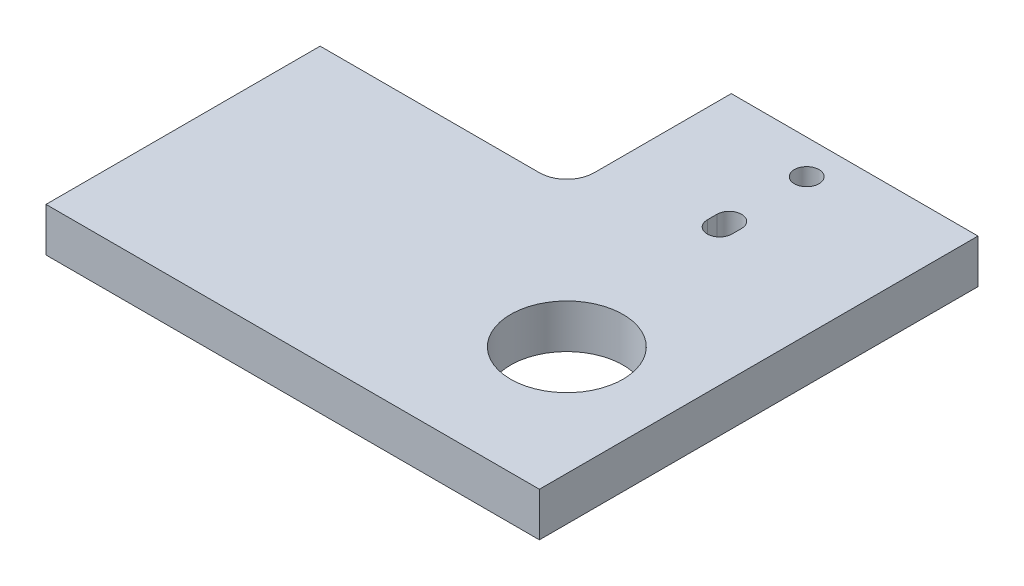
ISO-10303-21;
HEADER;
FILE_DESCRIPTION(('STEP AP214'),'2;1');
FILE_NAME('part.step','',(''),(''),'','','');
FILE_SCHEMA(('AUTOMOTIVE_DESIGN { 1 0 10303 214 1 1 1 1 }'));
ENDSEC;
DATA;
#1=APPLICATION_CONTEXT('core data for automotive mechanical design processes');
#2=APPLICATION_PROTOCOL_DEFINITION('international standard','automotive_design',2000,#1);
#3=PRODUCT_CONTEXT('',#1,'mechanical');
#4=PRODUCT('Part','Part','',(#3));
#5=PRODUCT_RELATED_PRODUCT_CATEGORY('part','',(#4));
#6=PRODUCT_DEFINITION_FORMATION('','',#4);
#7=PRODUCT_DEFINITION_CONTEXT('part definition',#1,'design');
#8=PRODUCT_DEFINITION('design','',#6,#7);
#9=PRODUCT_DEFINITION_SHAPE('','',#8);
#10=(LENGTH_UNIT() NAMED_UNIT(*) SI_UNIT(.MILLI.,.METRE.));
#11=(NAMED_UNIT(*) PLANE_ANGLE_UNIT() SI_UNIT($,.RADIAN.));
#12=(NAMED_UNIT(*) SI_UNIT($,.STERADIAN.) SOLID_ANGLE_UNIT());
#13=UNCERTAINTY_MEASURE_WITH_UNIT(LENGTH_MEASURE(1.E-05),#10,'distance_accuracy_value','');
#14=(GEOMETRIC_REPRESENTATION_CONTEXT(3) GLOBAL_UNCERTAINTY_ASSIGNED_CONTEXT((#13)) GLOBAL_UNIT_ASSIGNED_CONTEXT((#10,
#11,#12)) REPRESENTATION_CONTEXT('',''));
#15=CARTESIAN_POINT('',(0.,0.,0.));
#16=DIRECTION('',(0.,0.,1.));
#17=DIRECTION('',(1.,0.,0.));
#18=AXIS2_PLACEMENT_3D('',#15,#16,#17);
#19=CARTESIAN_POINT('',(10.,1.6,-16.));
#20=DIRECTION('',(0.,-1.,0.));
#21=DIRECTION('',(0.,0.,-1.));
#22=AXIS2_PLACEMENT_3D('',#19,#20,#21);
#23=PLANE('',#22);
#24=DIRECTION('',(0.,0.,-1.));
#25=VECTOR('',#24,1.);
#26=CARTESIAN_POINT('',(5.45,1.6,-11.925));
#27=LINE('',#26,#25);
#28=CARTESIAN_POINT('',(5.45,1.6,-11.575));
#29=VERTEX_POINT('',#28);
#30=CARTESIAN_POINT('',(5.45,1.6,-11.925));
#31=VERTEX_POINT('',#30);
#32=EDGE_CURVE('E149',#29,#31,#27,.T.);
#33=ORIENTED_EDGE('',*,*,#32,.F.);
#34=CARTESIAN_POINT('',(5.,1.6,-11.575));
#35=DIRECTION('',(0.,1.,0.));
#36=DIRECTION('',(0.,0.,1.));
#37=AXIS2_PLACEMENT_3D('',#34,#35,#36);
#38=CIRCLE('',#37,0.450000000000002);
#39=CARTESIAN_POINT('',(4.55,1.6,-11.575));
#40=VERTEX_POINT('',#39);
#41=EDGE_CURVE('E122',#40,#29,#38,.T.);
#42=ORIENTED_EDGE('',*,*,#41,.F.);
#43=DIRECTION('',(0.,0.,1.));
#44=VECTOR('',#43,1.);
#45=CARTESIAN_POINT('',(4.55,1.6,-11.575));
#46=LINE('',#45,#44);
#47=CARTESIAN_POINT('',(4.55,1.6,-11.925));
#48=VERTEX_POINT('',#47);
#49=EDGE_CURVE('E140',#48,#40,#46,.T.);
#50=ORIENTED_EDGE('',*,*,#49,.F.);
#51=CARTESIAN_POINT('',(5.,1.6,-11.925));
#52=DIRECTION('',(0.,1.,0.));
#53=DIRECTION('',(0.,0.,1.));
#54=AXIS2_PLACEMENT_3D('',#51,#52,#53);
#55=CIRCLE('',#54,0.450000000000002);
#56=EDGE_CURVE('E143',#31,#48,#55,.T.);
#57=ORIENTED_EDGE('',*,*,#56,.F.);
#58=EDGE_LOOP('',(#33,#42,#50,#57));
#59=FACE_BOUND('',#58,.T.);
#60=CARTESIAN_POINT('',(5.,1.6,-14.75));
#61=DIRECTION('',(0.,1.,0.));
#62=DIRECTION('',(0.,0.,1.));
#63=AXIS2_PLACEMENT_3D('',#60,#61,#62);
#64=CIRCLE('',#63,0.450000000000002);
#65=CARTESIAN_POINT('',(5.,1.6,-14.3));
#66=VERTEX_POINT('',#65);
#67=EDGE_CURVE('E155',#66,#66,#64,.T.);
#68=ORIENTED_EDGE('',*,*,#67,.F.);
#69=EDGE_LOOP('',(#68));
#70=FACE_BOUND('',#69,.T.);
#71=DIRECTION('',(-1.,0.,0.));
#72=VECTOR('',#71,1.);
#73=CARTESIAN_POINT('',(0.999999999999997,1.6,-16.));
#74=LINE('',#73,#72);
#75=CARTESIAN_POINT('',(10.,1.6,-16.));
#76=VERTEX_POINT('',#75);
#77=CARTESIAN_POINT('',(0.999999999999997,1.6,-16.));
#78=VERTEX_POINT('',#77);
#79=EDGE_CURVE('E171',#76,#78,#74,.T.);
#80=ORIENTED_EDGE('',*,*,#79,.T.);
#81=DIRECTION('',(0.,0.,1.));
#82=VECTOR('',#81,1.);
#83=CARTESIAN_POINT('',(0.999999999999997,1.6,-10.));
#84=LINE('',#83,#82);
#85=CARTESIAN_POINT('',(0.999999999999997,1.6,-11.));
#86=VERTEX_POINT('',#85);
#87=EDGE_CURVE('E174',#78,#86,#84,.T.);
#88=ORIENTED_EDGE('',*,*,#87,.T.);
#89=CARTESIAN_POINT('',(0.,1.6,-11.));
#90=DIRECTION('',(0.,-1.,0.));
#91=DIRECTION('',(0.,0.,-1.));
#92=AXIS2_PLACEMENT_3D('',#89,#90,#91);
#93=CIRCLE('',#92,1.);
#94=CARTESIAN_POINT('',(0.,1.6,-10.));
#95=VERTEX_POINT('',#94);
#96=EDGE_CURVE('E11',#86,#95,#93,.T.);
#97=ORIENTED_EDGE('',*,*,#96,.T.);
#98=DIRECTION('',(-1.,0.,0.));
#99=VECTOR('',#98,1.);
#100=CARTESIAN_POINT('',(0.999999999999997,1.6,-10.));
#101=LINE('',#100,#99);
#102=CARTESIAN_POINT('',(-8.,1.6,-10.));
#103=VERTEX_POINT('',#102);
#104=EDGE_CURVE('E177',#95,#103,#101,.T.);
#105=ORIENTED_EDGE('',*,*,#104,.T.);
#106=DIRECTION('',(0.,0.,1.));
#107=VECTOR('',#106,1.);
#108=CARTESIAN_POINT('',(-8.,1.6,-10.));
#109=LINE('',#108,#107);
#110=CARTESIAN_POINT('',(-8.,1.6,0.));
#111=VERTEX_POINT('',#110);
#112=EDGE_CURVE('E179',#103,#111,#109,.T.);
#113=ORIENTED_EDGE('',*,*,#112,.T.);
#114=DIRECTION('',(1.,0.,0.));
#115=VECTOR('',#114,1.);
#116=CARTESIAN_POINT('',(0.,1.6,0.));
#117=LINE('',#116,#115);
#118=CARTESIAN_POINT('',(10.,1.6,0.));
#119=VERTEX_POINT('',#118);
#120=EDGE_CURVE('E181',#111,#119,#117,.T.);
#121=ORIENTED_EDGE('',*,*,#120,.T.);
#122=DIRECTION('',(0.,0.,-1.));
#123=VECTOR('',#122,1.);
#124=CARTESIAN_POINT('',(10.,1.6,-8.));
#125=LINE('',#124,#123);
#126=EDGE_CURVE('E183',#119,#76,#125,.T.);
#127=ORIENTED_EDGE('',*,*,#126,.T.);
#128=EDGE_LOOP('',(#80,#88,#97,#105,#113,#121,#127));
#129=FACE_BOUND('',#128,.T.);
#130=CARTESIAN_POINT('',(6.,1.6,-5.));
#131=DIRECTION('',(0.,1.,0.));
#132=DIRECTION('',(0.,0.,1.));
#133=AXIS2_PLACEMENT_3D('',#130,#131,#132);
#134=CIRCLE('',#133,2.05000000000001);
#135=CARTESIAN_POINT('',(6.,1.6,-2.94999999999999));
#136=VERTEX_POINT('',#135);
#137=EDGE_CURVE('E165',#136,#136,#134,.T.);
#138=ORIENTED_EDGE('',*,*,#137,.F.);
#139=EDGE_LOOP('',(#138));
#140=FACE_BOUND('',#139,.T.);
#141=ADVANCED_FACE('F34',(#59,#70,#129,#140),#23,.F.);
#142=CARTESIAN_POINT('',(10.,0.,-16.));
#143=DIRECTION('',(0.,-1.,0.));
#144=DIRECTION('',(0.,0.,-1.));
#145=AXIS2_PLACEMENT_3D('',#142,#143,#144);
#146=PLANE('',#145);
#147=CARTESIAN_POINT('',(5.,0.,-11.575));
#148=DIRECTION('',(0.,1.,0.));
#149=DIRECTION('',(0.,0.,1.));
#150=AXIS2_PLACEMENT_3D('',#147,#148,#149);
#151=CIRCLE('',#150,0.450000000000002);
#152=CARTESIAN_POINT('',(4.55,0.,-11.575));
#153=VERTEX_POINT('',#152);
#154=CARTESIAN_POINT('',(5.45,0.,-11.575));
#155=VERTEX_POINT('',#154);
#156=EDGE_CURVE('E119',#153,#155,#151,.T.);
#157=ORIENTED_EDGE('',*,*,#156,.T.);
#158=DIRECTION('',(0.,0.,-1.));
#159=VECTOR('',#158,1.);
#160=CARTESIAN_POINT('',(5.45,0.,-11.925));
#161=LINE('',#160,#159);
#162=CARTESIAN_POINT('',(5.45,0.,-11.925));
#163=VERTEX_POINT('',#162);
#164=EDGE_CURVE('E131',#155,#163,#161,.T.);
#165=ORIENTED_EDGE('',*,*,#164,.T.);
#166=CARTESIAN_POINT('',(5.,0.,-11.925));
#167=DIRECTION('',(0.,1.,0.));
#168=DIRECTION('',(0.,0.,1.));
#169=AXIS2_PLACEMENT_3D('',#166,#167,#168);
#170=CIRCLE('',#169,0.450000000000002);
#171=CARTESIAN_POINT('',(4.55,0.,-11.925));
#172=VERTEX_POINT('',#171);
#173=EDGE_CURVE('E135',#163,#172,#170,.T.);
#174=ORIENTED_EDGE('',*,*,#173,.T.);
#175=DIRECTION('',(0.,0.,1.));
#176=VECTOR('',#175,1.);
#177=CARTESIAN_POINT('',(4.55,0.,-11.575));
#178=LINE('',#177,#176);
#179=EDGE_CURVE('E127',#172,#153,#178,.T.);
#180=ORIENTED_EDGE('',*,*,#179,.T.);
#181=EDGE_LOOP('',(#157,#165,#174,#180));
#182=FACE_BOUND('',#181,.T.);
#183=CARTESIAN_POINT('',(5.,0.,-14.75));
#184=DIRECTION('',(0.,1.,0.));
#185=DIRECTION('',(0.,0.,1.));
#186=AXIS2_PLACEMENT_3D('',#183,#184,#185);
#187=CIRCLE('',#186,0.450000000000002);
#188=CARTESIAN_POINT('',(5.,0.,-14.3));
#189=VERTEX_POINT('',#188);
#190=EDGE_CURVE('E159',#189,#189,#187,.T.);
#191=ORIENTED_EDGE('',*,*,#190,.T.);
#192=EDGE_LOOP('',(#191));
#193=FACE_BOUND('',#192,.T.);
#194=DIRECTION('',(-1.,0.,0.));
#195=VECTOR('',#194,1.);
#196=CARTESIAN_POINT('',(0.999999999999997,0.,-16.));
#197=LINE('',#196,#195);
#198=CARTESIAN_POINT('',(10.,0.,-16.));
#199=VERTEX_POINT('',#198);
#200=CARTESIAN_POINT('',(0.999999999999997,0.,-16.));
#201=VERTEX_POINT('',#200);
#202=EDGE_CURVE('E168',#199,#201,#197,.T.);
#203=ORIENTED_EDGE('',*,*,#202,.F.);
#204=DIRECTION('',(0.,0.,-1.));
#205=VECTOR('',#204,1.);
#206=CARTESIAN_POINT('',(10.,0.,-16.));
#207=LINE('',#206,#205);
#208=CARTESIAN_POINT('',(10.,0.,0.));
#209=VERTEX_POINT('',#208);
#210=EDGE_CURVE('E175',#209,#199,#207,.T.);
#211=ORIENTED_EDGE('',*,*,#210,.F.);
#212=DIRECTION('',(1.,0.,0.));
#213=VECTOR('',#212,1.);
#214=CARTESIAN_POINT('',(0.,0.,0.));
#215=LINE('',#214,#213);
#216=CARTESIAN_POINT('',(-8.,0.,0.));
#217=VERTEX_POINT('',#216);
#218=EDGE_CURVE('E195',#217,#209,#215,.T.);
#219=ORIENTED_EDGE('',*,*,#218,.F.);
#220=DIRECTION('',(0.,0.,1.));
#221=VECTOR('',#220,1.);
#222=CARTESIAN_POINT('',(-8.,0.,-10.));
#223=LINE('',#222,#221);
#224=CARTESIAN_POINT('',(-8.,0.,-10.));
#225=VERTEX_POINT('',#224);
#226=EDGE_CURVE('E192',#225,#217,#223,.T.);
#227=ORIENTED_EDGE('',*,*,#226,.F.);
#228=DIRECTION('',(-1.,0.,0.));
#229=VECTOR('',#228,1.);
#230=CARTESIAN_POINT('',(0.999999999999997,0.,-10.));
#231=LINE('',#230,#229);
#232=CARTESIAN_POINT('',(0.,0.,-10.));
#233=VERTEX_POINT('',#232);
#234=EDGE_CURVE('E190',#233,#225,#231,.T.);
#235=ORIENTED_EDGE('',*,*,#234,.F.);
#236=CARTESIAN_POINT('',(0.,0.,-11.));
#237=DIRECTION('',(0.,-1.,0.));
#238=DIRECTION('',(0.,0.,-1.));
#239=AXIS2_PLACEMENT_3D('',#236,#237,#238);
#240=CIRCLE('',#239,1.);
#241=CARTESIAN_POINT('',(0.999999999999997,0.,-11.));
#242=VERTEX_POINT('',#241);
#243=EDGE_CURVE('E42',#233,#242,#240,.F.);
#244=ORIENTED_EDGE('',*,*,#243,.T.);
#245=DIRECTION('',(0.,0.,1.));
#246=VECTOR('',#245,1.);
#247=CARTESIAN_POINT('',(0.999999999999997,0.,-10.));
#248=LINE('',#247,#246);
#249=EDGE_CURVE('E188',#201,#242,#248,.T.);
#250=ORIENTED_EDGE('',*,*,#249,.F.);
#251=EDGE_LOOP('',(#203,#211,#219,#227,#235,#244,#250));
#252=FACE_BOUND('',#251,.T.);
#253=CARTESIAN_POINT('',(6.,0.,-5.));
#254=DIRECTION('',(0.,1.,0.));
#255=DIRECTION('',(0.,0.,1.));
#256=AXIS2_PLACEMENT_3D('',#253,#254,#255);
#257=CIRCLE('',#256,2.05000000000001);
#258=CARTESIAN_POINT('',(6.,0.,-2.94999999999999));
#259=VERTEX_POINT('',#258);
#260=EDGE_CURVE('E162',#259,#259,#257,.T.);
#261=ORIENTED_EDGE('',*,*,#260,.T.);
#262=EDGE_LOOP('',(#261));
#263=FACE_BOUND('',#262,.T.);
#264=ADVANCED_FACE('F137',(#182,#193,#252,#263),#146,.T.);
#265=CARTESIAN_POINT('',(0.999999999999997,1.6,-16.));
#266=DIRECTION('',(0.,0.,1.));
#267=DIRECTION('',(1.,0.,0.));
#268=AXIS2_PLACEMENT_3D('',#265,#266,#267);
#269=PLANE('',#268);
#270=ORIENTED_EDGE('',*,*,#202,.T.);
#271=DIRECTION('',(0.,-1.,0.));
#272=VECTOR('',#271,1.);
#273=CARTESIAN_POINT('',(0.999999999999997,1.6,-16.));
#274=LINE('',#273,#272);
#275=EDGE_CURVE('E210',#78,#201,#274,.T.);
#276=ORIENTED_EDGE('',*,*,#275,.F.);
#277=ORIENTED_EDGE('',*,*,#79,.F.);
#278=DIRECTION('',(0.,-1.,0.));
#279=VECTOR('',#278,1.);
#280=CARTESIAN_POINT('',(10.,1.6,-16.));
#281=LINE('',#280,#279);
#282=EDGE_CURVE('E185',#76,#199,#281,.T.);
#283=ORIENTED_EDGE('',*,*,#282,.T.);
#284=EDGE_LOOP('',(#270,#276,#277,#283));
#285=FACE_BOUND('',#284,.T.);
#286=ADVANCED_FACE('F250',(#285),#269,.F.);
#287=CARTESIAN_POINT('',(0.999999999999997,1.6,-10.));
#288=DIRECTION('',(1.,0.,0.));
#289=DIRECTION('',(0.,0.,-1.));
#290=AXIS2_PLACEMENT_3D('',#287,#288,#289);
#291=PLANE('',#290);
#292=ORIENTED_EDGE('',*,*,#249,.T.);
#293=DIRECTION('',(0.,-1.,0.));
#294=VECTOR('',#293,1.);
#295=CARTESIAN_POINT('',(0.999999999999997,1.6,-11.));
#296=LINE('',#295,#294);
#297=EDGE_CURVE('E49',#242,#86,#296,.F.);
#298=ORIENTED_EDGE('',*,*,#297,.T.);
#299=ORIENTED_EDGE('',*,*,#87,.F.);
#300=ORIENTED_EDGE('',*,*,#275,.T.);
#301=EDGE_LOOP('',(#292,#298,#299,#300));
#302=FACE_BOUND('',#301,.T.);
#303=ADVANCED_FACE('F267',(#302),#291,.F.);
#304=CARTESIAN_POINT('',(0.999999999999997,1.6,-10.));
#305=DIRECTION('',(0.,0.,1.));
#306=DIRECTION('',(1.,0.,0.));
#307=AXIS2_PLACEMENT_3D('',#304,#305,#306);
#308=PLANE('',#307);
#309=ORIENTED_EDGE('',*,*,#104,.F.);
#310=DIRECTION('',(0.,-1.,0.));
#311=VECTOR('',#310,1.);
#312=CARTESIAN_POINT('',(0.,0.,-10.));
#313=LINE('',#312,#311);
#314=EDGE_CURVE('E213',#95,#233,#313,.T.);
#315=ORIENTED_EDGE('',*,*,#314,.T.);
#316=ORIENTED_EDGE('',*,*,#234,.T.);
#317=DIRECTION('',(0.,-1.,0.));
#318=VECTOR('',#317,1.);
#319=CARTESIAN_POINT('',(-8.,1.6,-10.));
#320=LINE('',#319,#318);
#321=EDGE_CURVE('E207',#103,#225,#320,.T.);
#322=ORIENTED_EDGE('',*,*,#321,.F.);
#323=EDGE_LOOP('',(#309,#315,#316,#322));
#324=FACE_BOUND('',#323,.T.);
#325=ADVANCED_FACE('F219',(#324),#308,.F.);
#326=CARTESIAN_POINT('',(-8.,1.6,-10.));
#327=DIRECTION('',(1.,0.,0.));
#328=DIRECTION('',(0.,0.,-1.));
#329=AXIS2_PLACEMENT_3D('',#326,#327,#328);
#330=PLANE('',#329);
#331=ORIENTED_EDGE('',*,*,#226,.T.);
#332=DIRECTION('',(0.,-1.,0.));
#333=VECTOR('',#332,1.);
#334=CARTESIAN_POINT('',(-8.,1.6,0.));
#335=LINE('',#334,#333);
#336=EDGE_CURVE('E204',#111,#217,#335,.T.);
#337=ORIENTED_EDGE('',*,*,#336,.F.);
#338=ORIENTED_EDGE('',*,*,#112,.F.);
#339=ORIENTED_EDGE('',*,*,#321,.T.);
#340=EDGE_LOOP('',(#331,#337,#338,#339));
#341=FACE_BOUND('',#340,.T.);
#342=ADVANCED_FACE('F228',(#341),#330,.F.);
#343=CARTESIAN_POINT('',(0.,1.6,0.));
#344=DIRECTION('',(0.,0.,-1.));
#345=DIRECTION('',(-1.,0.,0.));
#346=AXIS2_PLACEMENT_3D('',#343,#344,#345);
#347=PLANE('',#346);
#348=ORIENTED_EDGE('',*,*,#218,.T.);
#349=DIRECTION('',(0.,-1.,0.));
#350=VECTOR('',#349,1.);
#351=CARTESIAN_POINT('',(10.,1.6,0.));
#352=LINE('',#351,#350);
#353=EDGE_CURVE('E201',#119,#209,#352,.T.);
#354=ORIENTED_EDGE('',*,*,#353,.F.);
#355=ORIENTED_EDGE('',*,*,#120,.F.);
#356=ORIENTED_EDGE('',*,*,#336,.T.);
#357=EDGE_LOOP('',(#348,#354,#355,#356));
#358=FACE_BOUND('',#357,.T.);
#359=ADVANCED_FACE('F232',(#358),#347,.F.);
#360=CARTESIAN_POINT('',(10.,1.6,-16.));
#361=DIRECTION('',(-1.,0.,0.));
#362=DIRECTION('',(0.,0.,1.));
#363=AXIS2_PLACEMENT_3D('',#360,#361,#362);
#364=PLANE('',#363);
#365=ORIENTED_EDGE('',*,*,#210,.T.);
#366=ORIENTED_EDGE('',*,*,#282,.F.);
#367=ORIENTED_EDGE('',*,*,#126,.F.);
#368=ORIENTED_EDGE('',*,*,#353,.T.);
#369=EDGE_LOOP('',(#365,#366,#367,#368));
#370=FACE_BOUND('',#369,.T.);
#371=ADVANCED_FACE('F257',(#370),#364,.F.);
#372=CARTESIAN_POINT('',(6.,1.6,-5.));
#373=DIRECTION('',(0.,-1.,0.));
#374=DIRECTION('',(0.,0.,-1.));
#375=AXIS2_PLACEMENT_3D('',#372,#373,#374);
#376=CYLINDRICAL_SURFACE('',#375,2.05000000000001);
#377=ORIENTED_EDGE('',*,*,#137,.T.);
#378=EDGE_LOOP('',(#377));
#379=FACE_BOUND('',#378,.T.);
#380=ORIENTED_EDGE('',*,*,#260,.F.);
#381=EDGE_LOOP('',(#380));
#382=FACE_BOUND('',#381,.T.);
#383=ADVANCED_FACE('F254',(#379,#382),#376,.F.);
#384=CARTESIAN_POINT('',(5.,0.,-14.75));
#385=DIRECTION('',(0.,1.,0.));
#386=DIRECTION('',(0.,0.,1.));
#387=AXIS2_PLACEMENT_3D('',#384,#385,#386);
#388=CYLINDRICAL_SURFACE('',#387,0.450000000000002);
#389=ORIENTED_EDGE('',*,*,#190,.F.);
#390=EDGE_LOOP('',(#389));
#391=FACE_BOUND('',#390,.T.);
#392=ORIENTED_EDGE('',*,*,#67,.T.);
#393=EDGE_LOOP('',(#392));
#394=FACE_BOUND('',#393,.T.);
#395=ADVANCED_FACE('F303',(#391,#394),#388,.F.);
#396=CARTESIAN_POINT('',(5.,0.,-11.575));
#397=DIRECTION('',(0.,1.,0.));
#398=DIRECTION('',(0.,0.,1.));
#399=AXIS2_PLACEMENT_3D('',#396,#397,#398);
#400=CYLINDRICAL_SURFACE('',#399,0.450000000000002);
#401=ORIENTED_EDGE('',*,*,#41,.T.);
#402=DIRECTION('',(0.,1.,0.));
#403=VECTOR('',#402,1.);
#404=CARTESIAN_POINT('',(5.45,0.,-11.575));
#405=LINE('',#404,#403);
#406=EDGE_CURVE('E115',#155,#29,#405,.T.);
#407=ORIENTED_EDGE('',*,*,#406,.F.);
#408=ORIENTED_EDGE('',*,*,#156,.F.);
#409=DIRECTION('',(0.,1.,0.));
#410=VECTOR('',#409,1.);
#411=CARTESIAN_POINT('',(4.55,0.,-11.575));
#412=LINE('',#411,#410);
#413=EDGE_CURVE('E153',#153,#40,#412,.T.);
#414=ORIENTED_EDGE('',*,*,#413,.T.);
#415=EDGE_LOOP('',(#401,#407,#408,#414));
#416=FACE_BOUND('',#415,.T.);
#417=ADVANCED_FACE('F117',(#416),#400,.F.);
#418=CARTESIAN_POINT('',(4.55,0.,-11.575));
#419=DIRECTION('',(-1.,0.,0.));
#420=DIRECTION('',(0.,0.,1.));
#421=AXIS2_PLACEMENT_3D('',#418,#419,#420);
#422=PLANE('',#421);
#423=ORIENTED_EDGE('',*,*,#49,.T.);
#424=ORIENTED_EDGE('',*,*,#413,.F.);
#425=ORIENTED_EDGE('',*,*,#179,.F.);
#426=DIRECTION('',(0.,1.,0.));
#427=VECTOR('',#426,1.);
#428=CARTESIAN_POINT('',(4.55,0.,-11.925));
#429=LINE('',#428,#427);
#430=EDGE_CURVE('E156',#172,#48,#429,.T.);
#431=ORIENTED_EDGE('',*,*,#430,.T.);
#432=EDGE_LOOP('',(#423,#424,#425,#431));
#433=FACE_BOUND('',#432,.T.);
#434=ADVANCED_FACE('F316',(#433),#422,.F.);
#435=CARTESIAN_POINT('',(5.,0.,-11.925));
#436=DIRECTION('',(0.,1.,0.));
#437=DIRECTION('',(0.,0.,1.));
#438=AXIS2_PLACEMENT_3D('',#435,#436,#437);
#439=CYLINDRICAL_SURFACE('',#438,0.450000000000002);
#440=ORIENTED_EDGE('',*,*,#56,.T.);
#441=ORIENTED_EDGE('',*,*,#430,.F.);
#442=ORIENTED_EDGE('',*,*,#173,.F.);
#443=DIRECTION('',(0.,1.,0.));
#444=VECTOR('',#443,1.);
#445=CARTESIAN_POINT('',(5.45,0.,-11.925));
#446=LINE('',#445,#444);
#447=EDGE_CURVE('E126',#163,#31,#446,.T.);
#448=ORIENTED_EDGE('',*,*,#447,.T.);
#449=EDGE_LOOP('',(#440,#441,#442,#448));
#450=FACE_BOUND('',#449,.T.);
#451=ADVANCED_FACE('F242',(#450),#439,.F.);
#452=CARTESIAN_POINT('',(5.45,0.,-11.925));
#453=DIRECTION('',(1.,0.,0.));
#454=DIRECTION('',(0.,0.,-1.));
#455=AXIS2_PLACEMENT_3D('',#452,#453,#454);
#456=PLANE('',#455);
#457=ORIENTED_EDGE('',*,*,#32,.T.);
#458=ORIENTED_EDGE('',*,*,#447,.F.);
#459=ORIENTED_EDGE('',*,*,#164,.F.);
#460=ORIENTED_EDGE('',*,*,#406,.T.);
#461=EDGE_LOOP('',(#457,#458,#459,#460));
#462=FACE_BOUND('',#461,.T.);
#463=ADVANCED_FACE('F132',(#462),#456,.F.);
#464=CARTESIAN_POINT('',(0.,1.6,-11.));
#465=DIRECTION('',(0.,1.,0.));
#466=DIRECTION('',(0.,0.,1.));
#467=AXIS2_PLACEMENT_3D('',#464,#465,#466);
#468=CYLINDRICAL_SURFACE('',#467,1.);
#469=ORIENTED_EDGE('',*,*,#96,.F.);
#470=ORIENTED_EDGE('',*,*,#297,.F.);
#471=ORIENTED_EDGE('',*,*,#243,.F.);
#472=ORIENTED_EDGE('',*,*,#314,.F.);
#473=EDGE_LOOP('',(#469,#470,#471,#472));
#474=FACE_BOUND('',#473,.T.);
#475=ADVANCED_FACE('F36',(#474),#468,.F.);
#476=CLOSED_SHELL('',(#141,#264,#286,#303,#325,#342,#359,#371,#383,#395,#417,#434,#451,#463,#475));
#477=MANIFOLD_SOLID_BREP('B2',#476);
#478=ADVANCED_BREP_SHAPE_REPRESENTATION('',(#18,#477),#14);
#479=SHAPE_DEFINITION_REPRESENTATION(#9,#478);
ENDSEC;
END-ISO-10303-21;
